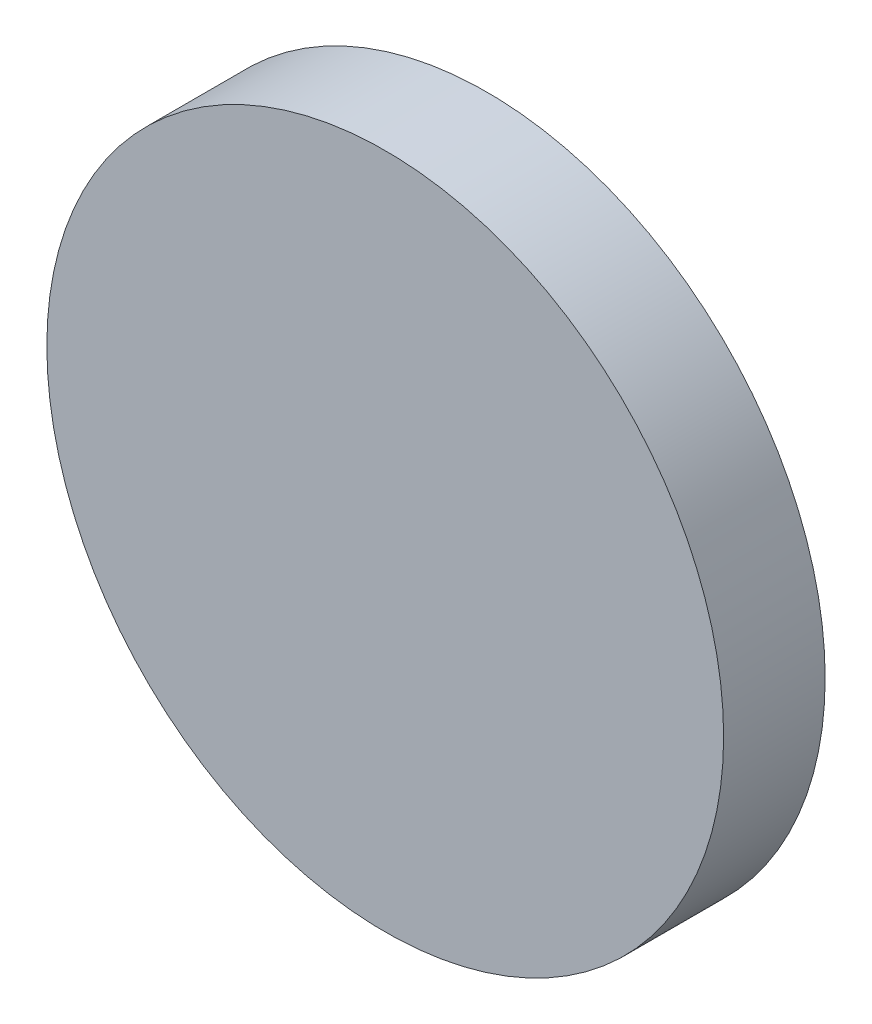
ISO-10303-21;
HEADER;
FILE_DESCRIPTION(('STEP AP214'),'2;1');
FILE_NAME('part.step','',(''),(''),'','','');
FILE_SCHEMA(('AUTOMOTIVE_DESIGN { 1 0 10303 214 1 1 1 1 }'));
ENDSEC;
DATA;
#1=APPLICATION_CONTEXT('core data for automotive mechanical design processes');
#2=APPLICATION_PROTOCOL_DEFINITION('international standard','automotive_design',2000,#1);
#3=PRODUCT_CONTEXT('',#1,'mechanical');
#4=PRODUCT('Part','Part','',(#3));
#5=PRODUCT_RELATED_PRODUCT_CATEGORY('part','',(#4));
#6=PRODUCT_DEFINITION_FORMATION('','',#4);
#7=PRODUCT_DEFINITION_CONTEXT('part definition',#1,'design');
#8=PRODUCT_DEFINITION('design','',#6,#7);
#9=PRODUCT_DEFINITION_SHAPE('','',#8);
#10=(LENGTH_UNIT() NAMED_UNIT(*) SI_UNIT(.MILLI.,.METRE.));
#11=(NAMED_UNIT(*) PLANE_ANGLE_UNIT() SI_UNIT($,.RADIAN.));
#12=(NAMED_UNIT(*) SI_UNIT($,.STERADIAN.) SOLID_ANGLE_UNIT());
#13=UNCERTAINTY_MEASURE_WITH_UNIT(LENGTH_MEASURE(1.E-05),#10,'distance_accuracy_value','');
#14=(GEOMETRIC_REPRESENTATION_CONTEXT(3) GLOBAL_UNCERTAINTY_ASSIGNED_CONTEXT((#13)) GLOBAL_UNIT_ASSIGNED_CONTEXT((#10,
#11,#12)) REPRESENTATION_CONTEXT('',''));
#15=CARTESIAN_POINT('',(0.,0.,0.));
#16=DIRECTION('',(0.,0.,1.));
#17=DIRECTION('',(1.,0.,0.));
#18=AXIS2_PLACEMENT_3D('',#15,#16,#17);
#19=CARTESIAN_POINT('',(0.,0.,30.));
#20=DIRECTION('',(0.,0.,-1.));
#21=DIRECTION('',(-1.,0.,0.));
#22=AXIS2_PLACEMENT_3D('',#19,#20,#21);
#23=CYLINDRICAL_SURFACE('',#22,100.);
#24=CARTESIAN_POINT('',(0.,0.,30.));
#25=DIRECTION('',(0.,0.,1.));
#26=DIRECTION('',(1.,0.,0.));
#27=AXIS2_PLACEMENT_3D('',#24,#25,#26);
#28=CIRCLE('',#27,100.);
#29=CARTESIAN_POINT('',(100.,0.,30.));
#30=VERTEX_POINT('',#29);
#31=EDGE_CURVE('E10',#30,#30,#28,.T.);
#32=ORIENTED_EDGE('',*,*,#31,.F.);
#33=EDGE_LOOP('',(#32));
#34=FACE_BOUND('',#33,.T.);
#35=CARTESIAN_POINT('',(0.,0.,0.));
#36=DIRECTION('',(0.,0.,1.));
#37=DIRECTION('',(1.,0.,0.));
#38=AXIS2_PLACEMENT_3D('',#35,#36,#37);
#39=CIRCLE('',#38,100.);
#40=CARTESIAN_POINT('',(100.,0.,0.));
#41=VERTEX_POINT('',#40);
#42=EDGE_CURVE('E38',#41,#41,#39,.T.);
#43=ORIENTED_EDGE('',*,*,#42,.T.);
#44=EDGE_LOOP('',(#43));
#45=FACE_BOUND('',#44,.T.);
#46=ADVANCED_FACE('F35',(#34,#45),#23,.T.);
#47=CARTESIAN_POINT('',(0.,0.,30.));
#48=DIRECTION('',(0.,0.,1.));
#49=DIRECTION('',(1.,0.,0.));
#50=AXIS2_PLACEMENT_3D('',#47,#48,#49);
#51=PLANE('',#50);
#52=ORIENTED_EDGE('',*,*,#31,.T.);
#53=EDGE_LOOP('',(#52));
#54=FACE_BOUND('',#53,.T.);
#55=ADVANCED_FACE('F50',(#54),#51,.T.);
#56=CARTESIAN_POINT('',(0.,0.,0.));
#57=DIRECTION('',(0.,0.,1.));
#58=DIRECTION('',(1.,0.,0.));
#59=AXIS2_PLACEMENT_3D('',#56,#57,#58);
#60=PLANE('',#59);
#61=ORIENTED_EDGE('',*,*,#42,.F.);
#62=EDGE_LOOP('',(#61));
#63=FACE_BOUND('',#62,.T.);
#64=ADVANCED_FACE('F48',(#63),#60,.F.);
#65=CLOSED_SHELL('',(#46,#55,#64));
#66=MANIFOLD_SOLID_BREP('B2',#65);
#67=ADVANCED_BREP_SHAPE_REPRESENTATION('',(#18,#66),#14);
#68=SHAPE_DEFINITION_REPRESENTATION(#9,#67);
ENDSEC;
END-ISO-10303-21;
